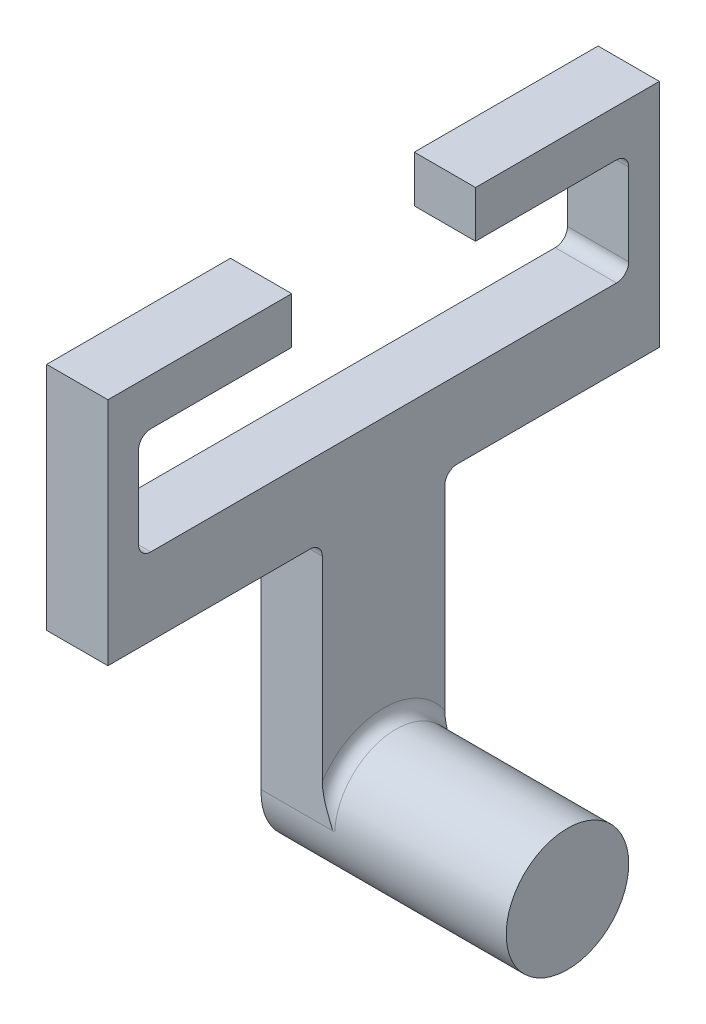
ISO-10303-21;
HEADER;
FILE_DESCRIPTION(('STEP AP214'),'2;1');
FILE_NAME('part.step','',(''),(''),'','','');
FILE_SCHEMA(('AUTOMOTIVE_DESIGN { 1 0 10303 214 1 1 1 1 }'));
ENDSEC;
DATA;
#1=APPLICATION_CONTEXT('core data for automotive mechanical design processes');
#2=APPLICATION_PROTOCOL_DEFINITION('international standard','automotive_design',2000,#1);
#3=PRODUCT_CONTEXT('',#1,'mechanical');
#4=PRODUCT('Part','Part','',(#3));
#5=PRODUCT_RELATED_PRODUCT_CATEGORY('part','',(#4));
#6=PRODUCT_DEFINITION_FORMATION('','',#4);
#7=PRODUCT_DEFINITION_CONTEXT('part definition',#1,'design');
#8=PRODUCT_DEFINITION('design','',#6,#7);
#9=PRODUCT_DEFINITION_SHAPE('','',#8);
#10=(LENGTH_UNIT() NAMED_UNIT(*) SI_UNIT(.MILLI.,.METRE.));
#11=(NAMED_UNIT(*) PLANE_ANGLE_UNIT() SI_UNIT($,.RADIAN.));
#12=(NAMED_UNIT(*) SI_UNIT($,.STERADIAN.) SOLID_ANGLE_UNIT());
#13=UNCERTAINTY_MEASURE_WITH_UNIT(LENGTH_MEASURE(1.E-05),#10,'distance_accuracy_value','');
#14=(GEOMETRIC_REPRESENTATION_CONTEXT(3) GLOBAL_UNCERTAINTY_ASSIGNED_CONTEXT((#13)) GLOBAL_UNIT_ASSIGNED_CONTEXT((#10,
#11,#12)) REPRESENTATION_CONTEXT('',''));
#15=CARTESIAN_POINT('',(0.,0.,0.));
#16=DIRECTION('',(0.,0.,1.));
#17=DIRECTION('',(1.,0.,0.));
#18=AXIS2_PLACEMENT_3D('',#15,#16,#17);
#19=CARTESIAN_POINT('',(12.7,0.60873287463422,-12.6854028035116));
#20=DIRECTION('',(0.,0.,-1.));
#21=DIRECTION('',(-1.,0.,0.));
#22=AXIS2_PLACEMENT_3D('',#19,#20,#21);
#23=PLANE('',#22);
#24=DIRECTION('',(0.,-1.,0.));
#25=VECTOR('',#24,1.);
#26=CARTESIAN_POINT('',(0.,0.60873287463422,-12.6854028035116));
#27=LINE('',#26,#25);
#28=CARTESIAN_POINT('',(0.,48.8512941545788,-12.6854028035116));
#29=VERTEX_POINT('',#28);
#30=CARTESIAN_POINT('',(0.,0.60873287463422,-12.6854028035116));
#31=VERTEX_POINT('',#30);
#32=EDGE_CURVE('E310',#29,#31,#27,.T.);
#33=ORIENTED_EDGE('',*,*,#32,.F.);
#34=DIRECTION('',(1.,0.,0.));
#35=VECTOR('',#34,1.);
#36=CARTESIAN_POINT('',(12.7,48.8512941545788,-12.6854028035116));
#37=LINE('',#36,#35);
#38=CARTESIAN_POINT('',(12.7,48.8512941545788,-12.6854028035116));
#39=VERTEX_POINT('',#38);
#40=EDGE_CURVE('E345',#29,#39,#37,.T.);
#41=ORIENTED_EDGE('',*,*,#40,.T.);
#42=DIRECTION('',(0.,-1.,0.));
#43=VECTOR('',#42,1.);
#44=CARTESIAN_POINT('',(12.7,0.60873287463422,-12.6854028035116));
#45=LINE('',#44,#43);
#46=CARTESIAN_POINT('',(12.7,8.44619178758454,-12.6854028035116));
#47=VERTEX_POINT('',#46);
#48=EDGE_CURVE('E313',#39,#47,#45,.T.);
#49=ORIENTED_EDGE('',*,*,#48,.T.);
#50=CARTESIAN_POINT('',(12.7,8.44619178758454,-12.6854028035116));
#51=CARTESIAN_POINT('',(12.7000199538334,8.29108034894553,-12.6854028035116));
#52=CARTESIAN_POINT('',(12.7043629306303,8.13601724831458,-12.6854028035116));
#53=CARTESIAN_POINT('',(12.7208410975088,7.82638745973549,-12.6854028035116));
#54=CARTESIAN_POINT('',(12.7329718359365,7.67182053885642,-12.6854028035116));
#55=CARTESIAN_POINT('',(12.7641344973862,7.36379204516032,-12.6854028035116));
#56=CARTESIAN_POINT('',(12.783149021093,7.21032867166333,-12.6854028035116));
#57=CARTESIAN_POINT('',(12.827370309528,6.90428378887194,-12.6854028035116));
#58=CARTESIAN_POINT('',(12.8525780510233,6.75170242257287,-12.6854028035116));
#59=CARTESIAN_POINT('',(12.9361065344603,6.29765825085691,-12.6854028035116));
#60=CARTESIAN_POINT('',(13.0025760106628,5.99768071526703,-12.6854028035116));
#61=CARTESIAN_POINT('',(13.1530521629393,5.4020947167015,-12.6854028035116));
#62=CARTESIAN_POINT('',(13.2370685109218,5.10648875998791,-12.6854028035116));
#63=CARTESIAN_POINT('',(13.4065882409218,4.56012538132683,-12.6854028035116));
#64=CARTESIAN_POINT('',(13.4902900992569,4.30880288484307,-12.6854028035116));
#65=CARTESIAN_POINT('',(13.6663463153401,3.80910815345246,-12.6854028035116));
#66=CARTESIAN_POINT('',(13.7587043355169,3.56073721788861,-12.6854028035116));
#67=CARTESIAN_POINT('',(13.9841718850627,2.98011271995535,-12.6854028035116));
#68=CARTESIAN_POINT('',(14.1202113648025,2.64899797616776,-12.6854028035116));
#69=CARTESIAN_POINT('',(14.3551273511572,2.10415574355069,-12.6854028035116));
#70=CARTESIAN_POINT('',(14.4507886346712,1.88903616348578,-12.6854028035116));
#71=CARTESIAN_POINT('',(14.6141782447484,1.53662732210931,-12.6854028035116));
#72=CARTESIAN_POINT('',(14.6799668565523,1.39844538977251,-12.6854028035116));
#73=CARTESIAN_POINT('',(14.7931167203293,1.17290997907176,-12.6854028035116));
#74=CARTESIAN_POINT('',(14.8388326494562,1.08475334883655,-12.6854028035116));
#75=CARTESIAN_POINT('',(14.9188994339259,0.941580735642722,-12.6854028035116));
#76=CARTESIAN_POINT('',(14.9516762265903,0.885697896916426,-12.6854028035116));
#77=CARTESIAN_POINT('',(15.0105568919323,0.795522676826605,-12.6854028035116));
#78=CARTESIAN_POINT('',(15.0351676302852,0.760321213460615,-12.6854028035116));
#79=CARTESIAN_POINT('',(15.0759831932472,0.710346334781367,-12.6854028035116));
#80=CARTESIAN_POINT('',(15.090331012591,0.694075154560967,-12.6854028035116));
#81=CARTESIAN_POINT('',(15.1210882623445,0.663571339352901,-12.6854028035116));
#82=CARTESIAN_POINT('',(15.1374862345175,0.649328248766124,-12.6854028035116));
#83=CARTESIAN_POINT('',(15.1627471893593,0.632590206960592,-12.6854028035116));
#84=CARTESIAN_POINT('',(15.1702880497681,0.62814758762387,-12.6854028035116));
#85=CARTESIAN_POINT('',(15.1859064876263,0.6204017604568,-12.6854028035116));
#86=CARTESIAN_POINT('',(15.1939810619624,0.617092733103913,-12.6854028035116));
#87=CARTESIAN_POINT('',(15.2083621731441,0.612684306654888,-12.6854028035116));
#88=CARTESIAN_POINT('',(15.2145580073585,0.611229628175883,-12.6854028035116));
#89=CARTESIAN_POINT('',(15.227162237969,0.609241410298296,-12.6854028035116));
#90=CARTESIAN_POINT('',(15.2335722121879,0.608718047644989,-12.6854028035116));
#91=CARTESIAN_POINT('',(15.24,0.608732874634247,-12.6854028035116));
#92=B_SPLINE_CURVE_WITH_KNOTS('',3,(#50,#51,#52,#53,#54,#55,#56,#57,#58,#59,#60,#61,#62,#63,#64,
#65,#66,#67,#68,#69,#70,#71,#72,#73,#74,#75,#76,#77,#78,#79,#80,#81,#82,#83,#84,#85,#86,#87,#88,
#89,#90,#91),.UNSPECIFIED.,.F.,.F.,(4,2,2,2,2,2,2,2,2,2,2,2,2,2,2,2,2,2,2,2,4),(0.,
0.465204438937266,0.930143193380325,1.3939148903106,1.85775977829041,2.77878287334151,
3.70031498637004,4.49481370709974,5.2896501115556,6.36331651432781,7.06953483439223,
7.52861759673658,7.82642837376192,8.0207069914985,8.14926890803821,8.21429199137582,
8.27896667442439,8.30515911704494,8.33121500647696,8.35024147580575,8.36947460475692),.UNSPECIFIED.);
#93=CARTESIAN_POINT('',(15.24,0.60873287463422,-12.6854028035116));
#94=VERTEX_POINT('',#93);
#95=EDGE_CURVE('E413',#47,#94,#92,.T.);
#96=ORIENTED_EDGE('',*,*,#95,.T.);
#97=DIRECTION('',(-1.,0.,0.));
#98=VECTOR('',#97,1.);
#99=CARTESIAN_POINT('',(12.7,0.60873287463422,-12.6854028035116));
#100=LINE('',#99,#98);
#101=EDGE_CURVE('E323',#94,#31,#100,.T.);
#102=ORIENTED_EDGE('',*,*,#101,.T.);
#103=EDGE_LOOP('',(#33,#41,#49,#96,#102));
#104=FACE_BOUND('',#103,.T.);
#105=ADVANCED_FACE('F47',(#104),#23,.T.);
#106=CARTESIAN_POINT('',(12.7,0.60873287463422,12.7145971964884));
#107=DIRECTION('',(0.,0.,1.));
#108=DIRECTION('',(1.,0.,0.));
#109=AXIS2_PLACEMENT_3D('',#106,#107,#108);
#110=PLANE('',#109);
#111=DIRECTION('',(0.,1.,0.));
#112=VECTOR('',#111,1.);
#113=CARTESIAN_POINT('',(12.7,0.60873287463422,12.7145971964884));
#114=LINE('',#113,#112);
#115=CARTESIAN_POINT('',(12.7,8.40217936794073,12.7145971964884));
#116=VERTEX_POINT('',#115);
#117=CARTESIAN_POINT('',(12.7,48.8512941545788,12.7145971964884));
#118=VERTEX_POINT('',#117);
#119=EDGE_CURVE('E320',#116,#118,#114,.T.);
#120=ORIENTED_EDGE('',*,*,#119,.T.);
#121=DIRECTION('',(-1.,0.,0.));
#122=VECTOR('',#121,1.);
#123=CARTESIAN_POINT('',(12.7,48.8512941545788,12.7145971964884));
#124=LINE('',#123,#122);
#125=CARTESIAN_POINT('',(0.,48.8512941545788,12.7145971964884));
#126=VERTEX_POINT('',#125);
#127=EDGE_CURVE('E340',#118,#126,#124,.T.);
#128=ORIENTED_EDGE('',*,*,#127,.T.);
#129=DIRECTION('',(0.,1.,0.));
#130=VECTOR('',#129,1.);
#131=CARTESIAN_POINT('',(0.,0.60873287463422,12.7145971964884));
#132=LINE('',#131,#130);
#133=CARTESIAN_POINT('',(0.,0.60873287463422,12.7145971964884));
#134=VERTEX_POINT('',#133);
#135=EDGE_CURVE('E319',#134,#126,#132,.T.);
#136=ORIENTED_EDGE('',*,*,#135,.F.);
#137=DIRECTION('',(-1.,0.,0.));
#138=VECTOR('',#137,1.);
#139=CARTESIAN_POINT('',(12.7,0.60873287463422,12.7145971964884));
#140=LINE('',#139,#138);
#141=CARTESIAN_POINT('',(14.8562200036249,0.60873287463422,12.7145971964884));
#142=VERTEX_POINT('',#141);
#143=EDGE_CURVE('E65',#142,#134,#140,.T.);
#144=ORIENTED_EDGE('',*,*,#143,.F.);
#145=CARTESIAN_POINT('',(14.8562200036249,0.60873287463422,12.7145971964884));
#146=CARTESIAN_POINT('',(14.8402694847375,0.659588422944848,12.7145971964884));
#147=CARTESIAN_POINT('',(14.8235087742083,0.710176230850901,12.7145971964884));
#148=CARTESIAN_POINT('',(14.7888182074626,0.810938242437549,12.7145971964884));
#149=CARTESIAN_POINT('',(14.7708886218373,0.861112538836686,12.7145971964884));
#150=CARTESIAN_POINT('',(14.7160247264327,1.0111962412902,12.7145971964884));
#151=CARTESIAN_POINT('',(14.678002958574,1.11070345786644,12.7145971964884));
#152=CARTESIAN_POINT('',(14.600720334161,1.30920367864751,12.7145971964884));
#153=CARTESIAN_POINT('',(14.5614597366873,1.40819678539233,12.7145971964884));
#154=CARTESIAN_POINT('',(14.4824555540848,1.60600135321982,12.7145971964884));
#155=CARTESIAN_POINT('',(14.4427119214337,1.70481279531061,12.7145971964884));
#156=CARTESIAN_POINT('',(14.3631168168194,1.90261959578859,12.7145971964884));
#157=CARTESIAN_POINT('',(14.323265287225,2.00161493061581,12.7145971964884));
#158=CARTESIAN_POINT('',(14.2438242998515,2.19970723356204,12.7145971964884));
#159=CARTESIAN_POINT('',(14.2042348341503,2.2988041985033,12.7145971964884));
#160=CARTESIAN_POINT('',(14.0861881045338,2.59638439660759,12.7145971964884));
#161=CARTESIAN_POINT('',(14.0084527984396,2.79515622140498,12.7145971964884));
#162=CARTESIAN_POINT('',(13.8571525497217,3.19147992719812,12.7145971964884));
#163=CARTESIAN_POINT('',(13.7835479833466,3.38901659640052,12.7145971964884));
#164=CARTESIAN_POINT('',(13.6405361506529,3.78562343086022,12.7145971964884));
#165=CARTESIAN_POINT('',(13.5711291157381,3.98469367998075,12.7145971964884));
#166=CARTESIAN_POINT('',(13.4376028242129,4.38443951433526,12.7145971964884));
#167=CARTESIAN_POINT('',(13.3734795237288,4.58511374047197,12.7145971964884));
#168=CARTESIAN_POINT('',(13.2515468994044,4.98835789996981,12.7145971964884));
#169=CARTESIAN_POINT('',(13.1937369554773,5.19092764503079,12.7145971964884));
#170=CARTESIAN_POINT('',(13.0747227568141,5.63899216353251,12.7145971964884));
#171=CARTESIAN_POINT('',(13.0151710157626,5.88493241780108,12.7145971964884));
#172=CARTESIAN_POINT('',(12.9091527429067,6.37957322216482,12.7145971964884));
#173=CARTESIAN_POINT('',(12.8626824079347,6.62827294809519,12.7145971964884));
#174=CARTESIAN_POINT('',(12.7851756403372,7.1301195241584,12.7145971964884));
#175=CARTESIAN_POINT('',(12.7542607420377,7.38328586936984,12.7145971964884));
#176=CARTESIAN_POINT('',(12.7223246047862,7.76442486092579,12.7145971964884));
#177=CARTESIAN_POINT('',(12.7140844616977,7.8918052269845,12.7145971964884));
#178=CARTESIAN_POINT('',(12.702925425082,8.14683970565905,12.7145971964884));
#179=CARTESIAN_POINT('',(12.7000083768433,8.27449389785143,12.7145971964884));
#180=CARTESIAN_POINT('',(12.7,8.40217936794073,12.7145971964884));
#181=B_SPLINE_CURVE_WITH_KNOTS('',3,(#145,#146,#147,#148,#149,#150,#151,#152,#153,#154,#155,
#156,#157,#158,#159,#160,#161,#162,#163,#164,#165,#166,#167,#168,#169,#170,#171,#172,#173,#174,
#175,#176,#177,#178,#179,#180),.UNSPECIFIED.,.F.,.F.,(4,2,2,2,2,2,2,2,2,2,2,2,2,2,2,2,2,4),(0.,
0.159869498076522,0.319702117349971,0.63925043722674,0.958732366143434,1.27824598527545,
1.5983927553695,1.91852980312207,2.55880620434556,3.19118197679594,3.82359257948346,
4.45551458590317,5.08737447013136,5.84621241770441,6.60482951932476,7.36928506259811,
7.75212583984181,8.13509930637001),.UNSPECIFIED.);
#182=EDGE_CURVE('E390',#142,#116,#181,.T.);
#183=ORIENTED_EDGE('',*,*,#182,.T.);
#184=EDGE_LOOP('',(#120,#128,#136,#144,#183));
#185=FACE_BOUND('',#184,.T.);
#186=ADVANCED_FACE('F408',(#185),#110,.T.);
#187=CARTESIAN_POINT('',(50.8,0.,0.));
#188=DIRECTION('',(-1.,0.,0.));
#189=DIRECTION('',(0.,0.,1.));
#190=AXIS2_PLACEMENT_3D('',#187,#188,#189);
#191=CYLINDRICAL_SURFACE('',#190,12.7);
#192=CARTESIAN_POINT('',(50.8,0.,0.));
#193=DIRECTION('',(1.,0.,0.));
#194=DIRECTION('',(0.,0.,-1.));
#195=AXIS2_PLACEMENT_3D('',#192,#193,#194);
#196=CIRCLE('',#195,12.7);
#197=CARTESIAN_POINT('',(50.8,0.,-12.7));
#198=VERTEX_POINT('',#197);
#199=EDGE_CURVE('E334',#198,#198,#196,.T.);
#200=ORIENTED_EDGE('',*,*,#199,.F.);
#201=EDGE_LOOP('',(#200));
#202=FACE_BOUND('',#201,.T.);
#203=CARTESIAN_POINT('',(15.24,0.,0.));
#204=DIRECTION('',(1.,0.,0.));
#205=DIRECTION('',(0.,0.,-1.));
#206=AXIS2_PLACEMENT_3D('',#203,#204,#205);
#207=CIRCLE('',#206,12.7);
#208=CARTESIAN_POINT('',(15.24,0.60873287463422,12.6854028035116));
#209=VERTEX_POINT('',#208);
#210=EDGE_CURVE('E346',#94,#209,#207,.T.);
#211=ORIENTED_EDGE('',*,*,#210,.T.);
#212=DIRECTION('',(-1.,0.,0.));
#213=VECTOR('',#212,1.);
#214=CARTESIAN_POINT('',(50.8,0.60873287463422,12.6854028035116));
#215=LINE('',#214,#213);
#216=CARTESIAN_POINT('',(0.,0.60873287463422,12.6854028035116));
#217=VERTEX_POINT('',#216);
#218=EDGE_CURVE('E329',#209,#217,#215,.T.);
#219=ORIENTED_EDGE('',*,*,#218,.T.);
#220=CARTESIAN_POINT('',(0.,0.,0.));
#221=DIRECTION('',(1.,0.,0.));
#222=DIRECTION('',(0.,0.,-1.));
#223=AXIS2_PLACEMENT_3D('',#220,#221,#222);
#224=CIRCLE('',#223,12.7);
#225=EDGE_CURVE('E333',#217,#31,#224,.T.);
#226=ORIENTED_EDGE('',*,*,#225,.T.);
#227=ORIENTED_EDGE('',*,*,#101,.F.);
#228=EDGE_LOOP('',(#211,#219,#226,#227));
#229=FACE_BOUND('',#228,.T.);
#230=ADVANCED_FACE('F530',(#202,#229),#191,.T.);
#231=CARTESIAN_POINT('',(50.8,0.,0.));
#232=DIRECTION('',(1.,0.,0.));
#233=DIRECTION('',(0.,0.,-1.));
#234=AXIS2_PLACEMENT_3D('',#231,#232,#233);
#235=PLANE('',#234);
#236=ORIENTED_EDGE('',*,*,#199,.T.);
#237=EDGE_LOOP('',(#236));
#238=FACE_BOUND('',#237,.T.);
#239=ADVANCED_FACE('F414',(#238),#235,.T.);
#240=CARTESIAN_POINT('',(0.,0.,0.));
#241=DIRECTION('',(1.,0.,0.));
#242=DIRECTION('',(0.,0.,-1.));
#243=AXIS2_PLACEMENT_3D('',#240,#241,#242);
#244=PLANE('',#243);
#245=DIRECTION('',(0.,0.,-1.));
#246=VECTOR('',#245,1.);
#247=CARTESIAN_POINT('',(0.,51.3912941545788,-50.8));
#248=LINE('',#247,#246);
#249=CARTESIAN_POINT('',(0.,51.3912941545788,-15.2254028035116));
#250=VERTEX_POINT('',#249);
#251=CARTESIAN_POINT('',(0.,51.3912941545788,-57.15));
#252=VERTEX_POINT('',#251);
#253=EDGE_CURVE('E288',#250,#252,#248,.T.);
#254=ORIENTED_EDGE('',*,*,#253,.F.);
#255=CARTESIAN_POINT('',(0.,48.8512941545788,-15.2254028035116));
#256=DIRECTION('',(1.,0.,0.));
#257=DIRECTION('',(0.,0.,-1.));
#258=AXIS2_PLACEMENT_3D('',#255,#256,#257);
#259=CIRCLE('',#258,2.54);
#260=EDGE_CURVE('E378',#250,#29,#259,.T.);
#261=ORIENTED_EDGE('',*,*,#260,.T.);
#262=ORIENTED_EDGE('',*,*,#32,.T.);
#263=ORIENTED_EDGE('',*,*,#225,.F.);
#264=DIRECTION('',(0.,0.,1.));
#265=VECTOR('',#264,1.);
#266=CARTESIAN_POINT('',(0.,0.60873287463422,-12.6854028035116));
#267=LINE('',#266,#265);
#268=EDGE_CURVE('E322',#217,#134,#267,.T.);
#269=ORIENTED_EDGE('',*,*,#268,.T.);
#270=ORIENTED_EDGE('',*,*,#135,.T.);
#271=CARTESIAN_POINT('',(0.,48.8512941545788,15.2545971964884));
#272=DIRECTION('',(1.,0.,0.));
#273=DIRECTION('',(0.,0.,-1.));
#274=AXIS2_PLACEMENT_3D('',#271,#272,#273);
#275=CIRCLE('',#274,2.54);
#276=CARTESIAN_POINT('',(0.,51.3912941545788,15.2545971964884));
#277=VERTEX_POINT('',#276);
#278=EDGE_CURVE('E373',#126,#277,#275,.T.);
#279=ORIENTED_EDGE('',*,*,#278,.T.);
#280=CARTESIAN_POINT('',(0.,51.3912941545788,57.15));
#281=VERTEX_POINT('',#280);
#282=EDGE_CURVE('E308',#281,#277,#248,.T.);
#283=ORIENTED_EDGE('',*,*,#282,.F.);
#284=DIRECTION('',(0.,-1.,0.));
#285=VECTOR('',#284,1.);
#286=CARTESIAN_POINT('',(0.,51.3912941545788,57.15));
#287=LINE('',#286,#285);
#288=CARTESIAN_POINT('',(0.,99.1432941545788,57.15));
#289=VERTEX_POINT('',#288);
#290=EDGE_CURVE('E279',#289,#281,#287,.T.);
#291=ORIENTED_EDGE('',*,*,#290,.F.);
#292=DIRECTION('',(0.,0.,1.));
#293=VECTOR('',#292,1.);
#294=CARTESIAN_POINT('',(0.,99.1432941545788,57.15));
#295=LINE('',#294,#293);
#296=CARTESIAN_POINT('',(0.,99.1432941545788,19.05));
#297=VERTEX_POINT('',#296);
#298=EDGE_CURVE('E224',#297,#289,#295,.T.);
#299=ORIENTED_EDGE('',*,*,#298,.F.);
#300=DIRECTION('',(0.,1.,0.));
#301=VECTOR('',#300,1.);
#302=CARTESIAN_POINT('',(0.,89.4912941545788,19.05));
#303=LINE('',#302,#301);
#304=CARTESIAN_POINT('',(0.,89.4912941545788,19.05));
#305=VERTEX_POINT('',#304);
#306=EDGE_CURVE('E242',#305,#297,#303,.T.);
#307=ORIENTED_EDGE('',*,*,#306,.F.);
#308=DIRECTION('',(0.,0.,-1.));
#309=VECTOR('',#308,1.);
#310=CARTESIAN_POINT('',(0.,89.4912941545788,57.15));
#311=LINE('',#310,#309);
#312=CARTESIAN_POINT('',(0.,89.4912941545788,48.26));
#313=VERTEX_POINT('',#312);
#314=EDGE_CURVE('E230',#313,#305,#311,.T.);
#315=ORIENTED_EDGE('',*,*,#314,.F.);
#316=CARTESIAN_POINT('',(0.,86.9512941545788,48.26));
#317=DIRECTION('',(1.,0.,0.));
#318=DIRECTION('',(0.,0.,-1.));
#319=AXIS2_PLACEMENT_3D('',#316,#317,#318);
#320=CIRCLE('',#319,2.54);
#321=CARTESIAN_POINT('',(0.,86.9512941545788,50.8));
#322=VERTEX_POINT('',#321);
#323=EDGE_CURVE('E75',#313,#322,#320,.T.);
#324=ORIENTED_EDGE('',*,*,#323,.T.);
#325=DIRECTION('',(0.,1.,0.));
#326=VECTOR('',#325,1.);
#327=CARTESIAN_POINT('',(0.,51.3912941545788,50.8));
#328=LINE('',#327,#326);
#329=CARTESIAN_POINT('',(0.,69.9332941545788,50.8));
#330=VERTEX_POINT('',#329);
#331=EDGE_CURVE('E282',#330,#322,#328,.T.);
#332=ORIENTED_EDGE('',*,*,#331,.F.);
#333=CARTESIAN_POINT('',(0.,69.9332941545788,48.26));
#334=DIRECTION('',(1.,0.,0.));
#335=DIRECTION('',(0.,0.,-1.));
#336=AXIS2_PLACEMENT_3D('',#333,#334,#335);
#337=CIRCLE('',#336,2.54);
#338=CARTESIAN_POINT('',(0.,67.3932941545788,48.26));
#339=VERTEX_POINT('',#338);
#340=EDGE_CURVE('E60',#330,#339,#337,.T.);
#341=ORIENTED_EDGE('',*,*,#340,.T.);
#342=DIRECTION('',(0.,0.,1.));
#343=VECTOR('',#342,1.);
#344=CARTESIAN_POINT('',(0.,67.3932941545788,-50.8));
#345=LINE('',#344,#343);
#346=CARTESIAN_POINT('',(0.,67.3932941545788,-48.26));
#347=VERTEX_POINT('',#346);
#348=EDGE_CURVE('E311',#347,#339,#345,.T.);
#349=ORIENTED_EDGE('',*,*,#348,.F.);
#350=CARTESIAN_POINT('',(0.,69.9332941545788,-48.26));
#351=DIRECTION('',(1.,0.,0.));
#352=DIRECTION('',(0.,0.,-1.));
#353=AXIS2_PLACEMENT_3D('',#350,#351,#352);
#354=CIRCLE('',#353,2.54);
#355=CARTESIAN_POINT('',(0.,69.9332941545788,-50.8));
#356=VERTEX_POINT('',#355);
#357=EDGE_CURVE('E428',#347,#356,#354,.T.);
#358=ORIENTED_EDGE('',*,*,#357,.T.);
#359=DIRECTION('',(0.,-1.,0.));
#360=VECTOR('',#359,1.);
#361=CARTESIAN_POINT('',(0.,51.3912941545788,-50.8));
#362=LINE('',#361,#360);
#363=CARTESIAN_POINT('',(0.,86.9512941545788,-50.8));
#364=VERTEX_POINT('',#363);
#365=EDGE_CURVE('E284',#364,#356,#362,.T.);
#366=ORIENTED_EDGE('',*,*,#365,.F.);
#367=CARTESIAN_POINT('',(0.,86.9512941545788,-48.26));
#368=DIRECTION('',(1.,0.,0.));
#369=DIRECTION('',(0.,0.,-1.));
#370=AXIS2_PLACEMENT_3D('',#367,#368,#369);
#371=CIRCLE('',#370,2.54);
#372=CARTESIAN_POINT('',(0.,89.4912941545788,-48.26));
#373=VERTEX_POINT('',#372);
#374=EDGE_CURVE('E422',#364,#373,#371,.T.);
#375=ORIENTED_EDGE('',*,*,#374,.T.);
#376=DIRECTION('',(0.,0.,-1.));
#377=VECTOR('',#376,1.);
#378=CARTESIAN_POINT('',(0.,89.4912941545788,-57.15));
#379=LINE('',#378,#377);
#380=CARTESIAN_POINT('',(0.,89.4912941545788,-19.05));
#381=VERTEX_POINT('',#380);
#382=EDGE_CURVE('E265',#381,#373,#379,.T.);
#383=ORIENTED_EDGE('',*,*,#382,.F.);
#384=DIRECTION('',(0.,-1.,0.));
#385=VECTOR('',#384,1.);
#386=CARTESIAN_POINT('',(0.,89.4912941545788,-19.05));
#387=LINE('',#386,#385);
#388=CARTESIAN_POINT('',(0.,99.1432941545788,-19.05));
#389=VERTEX_POINT('',#388);
#390=EDGE_CURVE('E263',#389,#381,#387,.T.);
#391=ORIENTED_EDGE('',*,*,#390,.F.);
#392=DIRECTION('',(0.,0.,1.));
#393=VECTOR('',#392,1.);
#394=CARTESIAN_POINT('',(0.,99.1432941545788,-57.15));
#395=LINE('',#394,#393);
#396=CARTESIAN_POINT('',(0.,99.1432941545788,-57.15));
#397=VERTEX_POINT('',#396);
#398=EDGE_CURVE('E244',#397,#389,#395,.T.);
#399=ORIENTED_EDGE('',*,*,#398,.F.);
#400=DIRECTION('',(0.,1.,0.));
#401=VECTOR('',#400,1.);
#402=CARTESIAN_POINT('',(0.,51.3912941545788,-57.15));
#403=LINE('',#402,#401);
#404=EDGE_CURVE('E292',#252,#397,#403,.T.);
#405=ORIENTED_EDGE('',*,*,#404,.F.);
#406=EDGE_LOOP('',(#254,#261,#262,#263,#269,#270,#279,#283,#291,#299,#307,#315,#324,#332,#341,
#349,#358,#366,#375,#383,#391,#399,#405));
#407=FACE_BOUND('',#406,.T.);
#408=ADVANCED_FACE('F404',(#407),#244,.F.);
#409=CARTESIAN_POINT('',(12.7,0.60873287463422,-12.6854028035116));
#410=DIRECTION('',(0.,-1.,0.));
#411=DIRECTION('',(0.,0.,-1.));
#412=AXIS2_PLACEMENT_3D('',#409,#410,#411);
#413=PLANE('',#412);
#414=ORIENTED_EDGE('',*,*,#218,.F.);
#415=CARTESIAN_POINT('',(15.24,0.60873287463422,12.6854028035116));
#416=CARTESIAN_POINT('',(15.1756670661884,0.60873287463422,12.6854098800125));
#417=CARTESIAN_POINT('',(15.1115189329188,0.60873287463422,12.6878462843443));
#418=CARTESIAN_POINT('',(14.9835922674604,0.60873287463422,12.6975777486697));
#419=CARTESIAN_POINT('',(14.9198137352716,0.60873287463422,12.7048728086636));
#420=CARTESIAN_POINT('',(14.8562200036249,0.60873287463422,12.7145971964886));
#421=B_SPLINE_CURVE_WITH_KNOTS('',3,(#415,#416,#417,#418,#419,#420),.UNSPECIFIED.,.F.,.F.,(4,2,
4),(0.,0.192583155058695,0.385166310127452),.UNSPECIFIED.);
#422=EDGE_CURVE('E382',#209,#142,#421,.T.);
#423=ORIENTED_EDGE('',*,*,#422,.T.);
#424=ORIENTED_EDGE('',*,*,#143,.T.);
#425=ORIENTED_EDGE('',*,*,#268,.F.);
#426=EDGE_LOOP('',(#414,#423,#424,#425));
#427=FACE_BOUND('',#426,.T.);
#428=ADVANCED_FACE('F396',(#427),#413,.T.);
#429=CARTESIAN_POINT('',(12.7,0.,0.));
#430=DIRECTION('',(1.,0.,0.));
#431=DIRECTION('',(0.,0.,-1.));
#432=AXIS2_PLACEMENT_3D('',#429,#430,#431);
#433=PLANE('',#432);
#434=ORIENTED_EDGE('',*,*,#119,.F.);
#435=CARTESIAN_POINT('',(12.7,0.,0.));
#436=DIRECTION('',(1.,0.,0.));
#437=DIRECTION('',(0.,0.,-1.));
#438=AXIS2_PLACEMENT_3D('',#435,#436,#437);
#439=CIRCLE('',#438,15.24);
#440=EDGE_CURVE('E355',#116,#47,#439,.F.);
#441=ORIENTED_EDGE('',*,*,#440,.T.);
#442=ORIENTED_EDGE('',*,*,#48,.F.);
#443=CARTESIAN_POINT('',(12.7,48.8512941545788,-15.2254028035116));
#444=DIRECTION('',(1.,0.,0.));
#445=DIRECTION('',(0.,0.,-1.));
#446=AXIS2_PLACEMENT_3D('',#443,#444,#445);
#447=CIRCLE('',#446,2.54);
#448=CARTESIAN_POINT('',(12.7,51.3912941545788,-15.2254028035116));
#449=VERTEX_POINT('',#448);
#450=EDGE_CURVE('E380',#39,#449,#447,.F.);
#451=ORIENTED_EDGE('',*,*,#450,.T.);
#452=DIRECTION('',(0.,0.,-1.));
#453=VECTOR('',#452,1.);
#454=CARTESIAN_POINT('',(12.7,51.3912941545788,-50.8));
#455=LINE('',#454,#453);
#456=CARTESIAN_POINT('',(12.7,51.3912941545788,-57.15));
#457=VERTEX_POINT('',#456);
#458=EDGE_CURVE('E302',#449,#457,#455,.T.);
#459=ORIENTED_EDGE('',*,*,#458,.T.);
#460=DIRECTION('',(0.,1.,0.));
#461=VECTOR('',#460,1.);
#462=CARTESIAN_POINT('',(12.7,51.3912941545788,-57.15));
#463=LINE('',#462,#461);
#464=CARTESIAN_POINT('',(12.7,99.1432941545788,-57.15));
#465=VERTEX_POINT('',#464);
#466=EDGE_CURVE('E293',#457,#465,#463,.T.);
#467=ORIENTED_EDGE('',*,*,#466,.T.);
#468=DIRECTION('',(0.,0.,1.));
#469=VECTOR('',#468,1.);
#470=CARTESIAN_POINT('',(12.7,99.1432941545788,-57.15));
#471=LINE('',#470,#469);
#472=CARTESIAN_POINT('',(12.7,99.1432941545788,-19.05));
#473=VERTEX_POINT('',#472);
#474=EDGE_CURVE('E267',#465,#473,#471,.T.);
#475=ORIENTED_EDGE('',*,*,#474,.T.);
#476=DIRECTION('',(0.,-1.,0.));
#477=VECTOR('',#476,1.);
#478=CARTESIAN_POINT('',(12.7,89.4912941545788,-19.05));
#479=LINE('',#478,#477);
#480=CARTESIAN_POINT('',(12.7,89.4912941545788,-19.05));
#481=VERTEX_POINT('',#480);
#482=EDGE_CURVE('E272',#473,#481,#479,.T.);
#483=ORIENTED_EDGE('',*,*,#482,.T.);
#484=DIRECTION('',(0.,0.,-1.));
#485=VECTOR('',#484,1.);
#486=CARTESIAN_POINT('',(12.7,89.4912941545788,-57.15));
#487=LINE('',#486,#485);
#488=CARTESIAN_POINT('',(12.7,89.4912941545788,-48.26));
#489=VERTEX_POINT('',#488);
#490=EDGE_CURVE('E262',#481,#489,#487,.T.);
#491=ORIENTED_EDGE('',*,*,#490,.T.);
#492=CARTESIAN_POINT('',(12.7,86.9512941545788,-48.26));
#493=DIRECTION('',(1.,0.,0.));
#494=DIRECTION('',(0.,0.,-1.));
#495=AXIS2_PLACEMENT_3D('',#492,#493,#494);
#496=CIRCLE('',#495,2.54);
#497=CARTESIAN_POINT('',(12.7,86.9512941545788,-50.8));
#498=VERTEX_POINT('',#497);
#499=EDGE_CURVE('E425',#489,#498,#496,.F.);
#500=ORIENTED_EDGE('',*,*,#499,.T.);
#501=DIRECTION('',(0.,-1.,0.));
#502=VECTOR('',#501,1.);
#503=CARTESIAN_POINT('',(12.7,51.3912941545788,-50.8));
#504=LINE('',#503,#502);
#505=CARTESIAN_POINT('',(12.7,69.9332941545788,-50.8));
#506=VERTEX_POINT('',#505);
#507=EDGE_CURVE('E295',#498,#506,#504,.T.);
#508=ORIENTED_EDGE('',*,*,#507,.T.);
#509=CARTESIAN_POINT('',(12.7,69.9332941545788,-48.26));
#510=DIRECTION('',(1.,0.,0.));
#511=DIRECTION('',(0.,0.,-1.));
#512=AXIS2_PLACEMENT_3D('',#509,#510,#511);
#513=CIRCLE('',#512,2.54);
#514=CARTESIAN_POINT('',(12.7,67.3932941545788,-48.26));
#515=VERTEX_POINT('',#514);
#516=EDGE_CURVE('E426',#506,#515,#513,.F.);
#517=ORIENTED_EDGE('',*,*,#516,.T.);
#518=DIRECTION('',(0.,0.,1.));
#519=VECTOR('',#518,1.);
#520=CARTESIAN_POINT('',(12.7,67.3932941545788,-50.8));
#521=LINE('',#520,#519);
#522=CARTESIAN_POINT('',(12.7,67.3932941545788,48.26));
#523=VERTEX_POINT('',#522);
#524=EDGE_CURVE('E303',#515,#523,#521,.T.);
#525=ORIENTED_EDGE('',*,*,#524,.T.);
#526=CARTESIAN_POINT('',(12.7,69.9332941545788,48.26));
#527=DIRECTION('',(1.,0.,0.));
#528=DIRECTION('',(0.,0.,-1.));
#529=AXIS2_PLACEMENT_3D('',#526,#527,#528);
#530=CIRCLE('',#529,2.54);
#531=CARTESIAN_POINT('',(12.7,69.9332941545788,50.8));
#532=VERTEX_POINT('',#531);
#533=EDGE_CURVE('E11',#523,#532,#530,.F.);
#534=ORIENTED_EDGE('',*,*,#533,.T.);
#535=DIRECTION('',(0.,1.,0.));
#536=VECTOR('',#535,1.);
#537=CARTESIAN_POINT('',(12.7,51.3912941545788,50.8));
#538=LINE('',#537,#536);
#539=CARTESIAN_POINT('',(12.7,86.9512941545788,50.8));
#540=VERTEX_POINT('',#539);
#541=EDGE_CURVE('E274',#532,#540,#538,.T.);
#542=ORIENTED_EDGE('',*,*,#541,.T.);
#543=CARTESIAN_POINT('',(12.7,86.9512941545788,48.26));
#544=DIRECTION('',(1.,0.,0.));
#545=DIRECTION('',(0.,0.,-1.));
#546=AXIS2_PLACEMENT_3D('',#543,#544,#545);
#547=CIRCLE('',#546,2.54);
#548=CARTESIAN_POINT('',(12.7,89.4912941545788,48.26));
#549=VERTEX_POINT('',#548);
#550=EDGE_CURVE('E218',#540,#549,#547,.F.);
#551=ORIENTED_EDGE('',*,*,#550,.T.);
#552=DIRECTION('',(0.,0.,-1.));
#553=VECTOR('',#552,1.);
#554=CARTESIAN_POINT('',(12.7,89.4912941545788,57.15));
#555=LINE('',#554,#553);
#556=CARTESIAN_POINT('',(12.7,89.4912941545788,19.05));
#557=VERTEX_POINT('',#556);
#558=EDGE_CURVE('E208',#549,#557,#555,.T.);
#559=ORIENTED_EDGE('',*,*,#558,.T.);
#560=DIRECTION('',(0.,1.,0.));
#561=VECTOR('',#560,1.);
#562=CARTESIAN_POINT('',(12.7,89.4912941545788,19.05));
#563=LINE('',#562,#561);
#564=CARTESIAN_POINT('',(12.7,99.1432941545788,19.05));
#565=VERTEX_POINT('',#564);
#566=EDGE_CURVE('E217',#557,#565,#563,.T.);
#567=ORIENTED_EDGE('',*,*,#566,.T.);
#568=DIRECTION('',(0.,0.,1.));
#569=VECTOR('',#568,1.);
#570=CARTESIAN_POINT('',(12.7,99.1432941545788,57.15));
#571=LINE('',#570,#569);
#572=CARTESIAN_POINT('',(12.7,99.1432941545788,57.15));
#573=VERTEX_POINT('',#572);
#574=EDGE_CURVE('E238',#565,#573,#571,.T.);
#575=ORIENTED_EDGE('',*,*,#574,.T.);
#576=DIRECTION('',(0.,-1.,0.));
#577=VECTOR('',#576,1.);
#578=CARTESIAN_POINT('',(12.7,51.3912941545788,57.15));
#579=LINE('',#578,#577);
#580=CARTESIAN_POINT('',(12.7,51.3912941545788,57.15));
#581=VERTEX_POINT('',#580);
#582=EDGE_CURVE('E278',#573,#581,#579,.T.);
#583=ORIENTED_EDGE('',*,*,#582,.T.);
#584=CARTESIAN_POINT('',(12.7,51.3912941545788,15.2545971964884));
#585=VERTEX_POINT('',#584);
#586=EDGE_CURVE('E297',#581,#585,#455,.T.);
#587=ORIENTED_EDGE('',*,*,#586,.T.);
#588=CARTESIAN_POINT('',(12.7,48.8512941545788,15.2545971964884));
#589=DIRECTION('',(1.,0.,0.));
#590=DIRECTION('',(0.,0.,-1.));
#591=AXIS2_PLACEMENT_3D('',#588,#589,#590);
#592=CIRCLE('',#591,2.54);
#593=EDGE_CURVE('E374',#585,#118,#592,.F.);
#594=ORIENTED_EDGE('',*,*,#593,.T.);
#595=EDGE_LOOP('',(#434,#441,#442,#451,#459,#467,#475,#483,#491,#500,#508,#517,#525,#534,#542,
#551,#559,#567,#575,#583,#587,#594));
#596=FACE_BOUND('',#595,.T.);
#597=ADVANCED_FACE('F212',(#596),#433,.T.);
#598=CARTESIAN_POINT('',(12.7,51.3912941545788,-50.8));
#599=DIRECTION('',(0.,1.,0.));
#600=DIRECTION('',(0.,0.,1.));
#601=AXIS2_PLACEMENT_3D('',#598,#599,#600);
#602=PLANE('',#601);
#603=ORIENTED_EDGE('',*,*,#458,.F.);
#604=DIRECTION('',(1.,0.,0.));
#605=VECTOR('',#604,1.);
#606=CARTESIAN_POINT('',(12.7,51.3912941545788,-15.2254028035116));
#607=LINE('',#606,#605);
#608=EDGE_CURVE('E350',#449,#250,#607,.F.);
#609=ORIENTED_EDGE('',*,*,#608,.T.);
#610=ORIENTED_EDGE('',*,*,#253,.T.);
#611=DIRECTION('',(-1.,0.,0.));
#612=VECTOR('',#611,1.);
#613=CARTESIAN_POINT('',(12.7,51.3912941545788,-57.15));
#614=LINE('',#613,#612);
#615=EDGE_CURVE('E235',#457,#252,#614,.T.);
#616=ORIENTED_EDGE('',*,*,#615,.F.);
#617=EDGE_LOOP('',(#603,#609,#610,#616));
#618=FACE_BOUND('',#617,.T.);
#619=ADVANCED_FACE('F480',(#618),#602,.F.);
#620=ORIENTED_EDGE('',*,*,#282,.T.);
#621=DIRECTION('',(-1.,0.,0.));
#622=VECTOR('',#621,1.);
#623=CARTESIAN_POINT('',(12.7,51.3912941545788,15.2545971964884));
#624=LINE('',#623,#622);
#625=EDGE_CURVE('E344',#277,#585,#624,.F.);
#626=ORIENTED_EDGE('',*,*,#625,.T.);
#627=ORIENTED_EDGE('',*,*,#586,.F.);
#628=DIRECTION('',(-1.,0.,0.));
#629=VECTOR('',#628,1.);
#630=CARTESIAN_POINT('',(12.7,51.3912941545788,57.15));
#631=LINE('',#630,#629);
#632=EDGE_CURVE('E276',#581,#281,#631,.T.);
#633=ORIENTED_EDGE('',*,*,#632,.T.);
#634=EDGE_LOOP('',(#620,#626,#627,#633));
#635=FACE_BOUND('',#634,.T.);
#636=ADVANCED_FACE('F457',(#635),#602,.F.);
#637=CARTESIAN_POINT('',(12.7,67.3932941545788,-50.8));
#638=DIRECTION('',(0.,-1.,0.));
#639=DIRECTION('',(0.,0.,-1.));
#640=AXIS2_PLACEMENT_3D('',#637,#638,#639);
#641=PLANE('',#640);
#642=ORIENTED_EDGE('',*,*,#524,.F.);
#643=DIRECTION('',(-1.,0.,0.));
#644=VECTOR('',#643,1.);
#645=CARTESIAN_POINT('',(0.,67.3932941545788,-48.26));
#646=LINE('',#645,#644);
#647=EDGE_CURVE('E361',#515,#347,#646,.T.);
#648=ORIENTED_EDGE('',*,*,#647,.T.);
#649=ORIENTED_EDGE('',*,*,#348,.T.);
#650=DIRECTION('',(-1.,0.,0.));
#651=VECTOR('',#650,1.);
#652=CARTESIAN_POINT('',(12.7,67.3932941545788,48.26));
#653=LINE('',#652,#651);
#654=EDGE_CURVE('E363',#339,#523,#653,.F.);
#655=ORIENTED_EDGE('',*,*,#654,.T.);
#656=EDGE_LOOP('',(#642,#648,#649,#655));
#657=FACE_BOUND('',#656,.T.);
#658=ADVANCED_FACE('F438',(#657),#641,.F.);
#659=CARTESIAN_POINT('',(12.7,51.3912941545788,-50.8));
#660=DIRECTION('',(0.,0.,-1.));
#661=DIRECTION('',(-1.,0.,0.));
#662=AXIS2_PLACEMENT_3D('',#659,#660,#661);
#663=PLANE('',#662);
#664=ORIENTED_EDGE('',*,*,#507,.F.);
#665=DIRECTION('',(-1.,0.,0.));
#666=VECTOR('',#665,1.);
#667=CARTESIAN_POINT('',(0.,86.9512941545788,-50.8));
#668=LINE('',#667,#666);
#669=EDGE_CURVE('E358',#498,#364,#668,.T.);
#670=ORIENTED_EDGE('',*,*,#669,.T.);
#671=ORIENTED_EDGE('',*,*,#365,.T.);
#672=DIRECTION('',(-1.,0.,0.));
#673=VECTOR('',#672,1.);
#674=CARTESIAN_POINT('',(12.7,69.9332941545788,-50.8));
#675=LINE('',#674,#673);
#676=EDGE_CURVE('E354',#356,#506,#675,.F.);
#677=ORIENTED_EDGE('',*,*,#676,.T.);
#678=EDGE_LOOP('',(#664,#670,#671,#677));
#679=FACE_BOUND('',#678,.T.);
#680=ADVANCED_FACE('F503',(#679),#663,.F.);
#681=CARTESIAN_POINT('',(12.7,51.3912941545788,-57.15));
#682=DIRECTION('',(0.,0.,1.));
#683=DIRECTION('',(1.,0.,0.));
#684=AXIS2_PLACEMENT_3D('',#681,#682,#683);
#685=PLANE('',#684);
#686=ORIENTED_EDGE('',*,*,#404,.T.);
#687=DIRECTION('',(-1.,0.,0.));
#688=VECTOR('',#687,1.);
#689=CARTESIAN_POINT('',(12.7,99.1432941545788,-57.15));
#690=LINE('',#689,#688);
#691=EDGE_CURVE('E255',#465,#397,#690,.T.);
#692=ORIENTED_EDGE('',*,*,#691,.F.);
#693=ORIENTED_EDGE('',*,*,#466,.F.);
#694=ORIENTED_EDGE('',*,*,#615,.T.);
#695=EDGE_LOOP('',(#686,#692,#693,#694));
#696=FACE_BOUND('',#695,.T.);
#697=ADVANCED_FACE('F485',(#696),#685,.F.);
#698=CARTESIAN_POINT('',(12.7,51.3912941545788,50.8));
#699=DIRECTION('',(0.,0.,1.));
#700=DIRECTION('',(1.,0.,0.));
#701=AXIS2_PLACEMENT_3D('',#698,#699,#700);
#702=PLANE('',#701);
#703=ORIENTED_EDGE('',*,*,#331,.T.);
#704=DIRECTION('',(-1.,0.,0.));
#705=VECTOR('',#704,1.);
#706=CARTESIAN_POINT('',(12.7,86.9512941545788,50.8));
#707=LINE('',#706,#705);
#708=EDGE_CURVE('E371',#322,#540,#707,.F.);
#709=ORIENTED_EDGE('',*,*,#708,.T.);
#710=ORIENTED_EDGE('',*,*,#541,.F.);
#711=DIRECTION('',(-1.,0.,0.));
#712=VECTOR('',#711,1.);
#713=CARTESIAN_POINT('',(0.,69.9332941545788,50.8));
#714=LINE('',#713,#712);
#715=EDGE_CURVE('E368',#532,#330,#714,.T.);
#716=ORIENTED_EDGE('',*,*,#715,.T.);
#717=EDGE_LOOP('',(#703,#709,#710,#716));
#718=FACE_BOUND('',#717,.T.);
#719=ADVANCED_FACE('F442',(#718),#702,.F.);
#720=CARTESIAN_POINT('',(12.7,51.3912941545788,57.15));
#721=DIRECTION('',(0.,0.,-1.));
#722=DIRECTION('',(0.,1.,0.));
#723=AXIS2_PLACEMENT_3D('',#720,#721,#722);
#724=PLANE('',#723);
#725=ORIENTED_EDGE('',*,*,#290,.T.);
#726=ORIENTED_EDGE('',*,*,#632,.F.);
#727=ORIENTED_EDGE('',*,*,#582,.F.);
#728=DIRECTION('',(-1.,0.,0.));
#729=VECTOR('',#728,1.);
#730=CARTESIAN_POINT('',(12.7,99.1432941545788,57.15));
#731=LINE('',#730,#729);
#732=EDGE_CURVE('E239',#573,#289,#731,.T.);
#733=ORIENTED_EDGE('',*,*,#732,.T.);
#734=EDGE_LOOP('',(#725,#726,#727,#733));
#735=FACE_BOUND('',#734,.T.);
#736=ADVANCED_FACE('F455',(#735),#724,.F.);
#737=CARTESIAN_POINT('',(12.7,89.4912941545788,57.15));
#738=DIRECTION('',(0.,1.,0.));
#739=DIRECTION('',(0.,0.,1.));
#740=AXIS2_PLACEMENT_3D('',#737,#738,#739);
#741=PLANE('',#740);
#742=ORIENTED_EDGE('',*,*,#558,.F.);
#743=DIRECTION('',(-1.,0.,0.));
#744=VECTOR('',#743,1.);
#745=CARTESIAN_POINT('',(0.,89.4912941545788,48.26));
#746=LINE('',#745,#744);
#747=EDGE_CURVE('E366',#549,#313,#746,.T.);
#748=ORIENTED_EDGE('',*,*,#747,.T.);
#749=ORIENTED_EDGE('',*,*,#314,.T.);
#750=DIRECTION('',(-1.,0.,0.));
#751=VECTOR('',#750,1.);
#752=CARTESIAN_POINT('',(12.7,89.4912941545788,19.05));
#753=LINE('',#752,#751);
#754=EDGE_CURVE('E227',#557,#305,#753,.T.);
#755=ORIENTED_EDGE('',*,*,#754,.F.);
#756=EDGE_LOOP('',(#742,#748,#749,#755));
#757=FACE_BOUND('',#756,.T.);
#758=ADVANCED_FACE('F226',(#757),#741,.F.);
#759=CARTESIAN_POINT('',(12.7,89.4912941545788,19.05));
#760=DIRECTION('',(0.,0.,1.));
#761=DIRECTION('',(1.,0.,0.));
#762=AXIS2_PLACEMENT_3D('',#759,#760,#761);
#763=PLANE('',#762);
#764=ORIENTED_EDGE('',*,*,#306,.T.);
#765=DIRECTION('',(-1.,0.,0.));
#766=VECTOR('',#765,1.);
#767=CARTESIAN_POINT('',(12.7,99.1432941545788,19.05));
#768=LINE('',#767,#766);
#769=EDGE_CURVE('E231',#565,#297,#768,.T.);
#770=ORIENTED_EDGE('',*,*,#769,.F.);
#771=ORIENTED_EDGE('',*,*,#566,.F.);
#772=ORIENTED_EDGE('',*,*,#754,.T.);
#773=EDGE_LOOP('',(#764,#770,#771,#772));
#774=FACE_BOUND('',#773,.T.);
#775=ADVANCED_FACE('F232',(#774),#763,.F.);
#776=CARTESIAN_POINT('',(12.7,99.1432941545788,57.15));
#777=DIRECTION('',(0.,-1.,0.));
#778=DIRECTION('',(0.,0.,-1.));
#779=AXIS2_PLACEMENT_3D('',#776,#777,#778);
#780=PLANE('',#779);
#781=ORIENTED_EDGE('',*,*,#298,.T.);
#782=ORIENTED_EDGE('',*,*,#732,.F.);
#783=ORIENTED_EDGE('',*,*,#574,.F.);
#784=ORIENTED_EDGE('',*,*,#769,.T.);
#785=EDGE_LOOP('',(#781,#782,#783,#784));
#786=FACE_BOUND('',#785,.T.);
#787=ADVANCED_FACE('F446',(#786),#780,.F.);
#788=CARTESIAN_POINT('',(12.7,99.1432941545788,-57.15));
#789=DIRECTION('',(0.,-1.,0.));
#790=DIRECTION('',(0.,0.,-1.));
#791=AXIS2_PLACEMENT_3D('',#788,#789,#790);
#792=PLANE('',#791);
#793=ORIENTED_EDGE('',*,*,#398,.T.);
#794=DIRECTION('',(-1.,0.,0.));
#795=VECTOR('',#794,1.);
#796=CARTESIAN_POINT('',(12.7,99.1432941545788,-19.05));
#797=LINE('',#796,#795);
#798=EDGE_CURVE('E253',#473,#389,#797,.T.);
#799=ORIENTED_EDGE('',*,*,#798,.F.);
#800=ORIENTED_EDGE('',*,*,#474,.F.);
#801=ORIENTED_EDGE('',*,*,#691,.T.);
#802=EDGE_LOOP('',(#793,#799,#800,#801));
#803=FACE_BOUND('',#802,.T.);
#804=ADVANCED_FACE('F488',(#803),#792,.F.);
#805=CARTESIAN_POINT('',(12.7,89.4912941545788,-19.05));
#806=DIRECTION('',(0.,0.,-1.));
#807=DIRECTION('',(-1.,0.,0.));
#808=AXIS2_PLACEMENT_3D('',#805,#806,#807);
#809=PLANE('',#808);
#810=ORIENTED_EDGE('',*,*,#390,.T.);
#811=DIRECTION('',(-1.,0.,0.));
#812=VECTOR('',#811,1.);
#813=CARTESIAN_POINT('',(12.7,89.4912941545788,-19.05));
#814=LINE('',#813,#812);
#815=EDGE_CURVE('E257',#481,#381,#814,.T.);
#816=ORIENTED_EDGE('',*,*,#815,.F.);
#817=ORIENTED_EDGE('',*,*,#482,.F.);
#818=ORIENTED_EDGE('',*,*,#798,.T.);
#819=EDGE_LOOP('',(#810,#816,#817,#818));
#820=FACE_BOUND('',#819,.T.);
#821=ADVANCED_FACE('F495',(#820),#809,.F.);
#822=CARTESIAN_POINT('',(12.7,89.4912941545788,-57.15));
#823=DIRECTION('',(0.,1.,0.));
#824=DIRECTION('',(0.,0.,1.));
#825=AXIS2_PLACEMENT_3D('',#822,#823,#824);
#826=PLANE('',#825);
#827=ORIENTED_EDGE('',*,*,#382,.T.);
#828=DIRECTION('',(-1.,0.,0.));
#829=VECTOR('',#828,1.);
#830=CARTESIAN_POINT('',(12.7,89.4912941545788,-48.26));
#831=LINE('',#830,#829);
#832=EDGE_CURVE('E360',#373,#489,#831,.F.);
#833=ORIENTED_EDGE('',*,*,#832,.T.);
#834=ORIENTED_EDGE('',*,*,#490,.F.);
#835=ORIENTED_EDGE('',*,*,#815,.T.);
#836=EDGE_LOOP('',(#827,#833,#834,#835));
#837=FACE_BOUND('',#836,.T.);
#838=ADVANCED_FACE('F521',(#837),#826,.F.);
#839=CARTESIAN_POINT('',(12.7,48.8512941545788,15.2545971964884));
#840=DIRECTION('',(-1.,0.,0.));
#841=DIRECTION('',(0.,0.,1.));
#842=AXIS2_PLACEMENT_3D('',#839,#840,#841);
#843=CYLINDRICAL_SURFACE('',#842,2.54);
#844=ORIENTED_EDGE('',*,*,#593,.F.);
#845=ORIENTED_EDGE('',*,*,#625,.F.);
#846=ORIENTED_EDGE('',*,*,#278,.F.);
#847=ORIENTED_EDGE('',*,*,#127,.F.);
#848=EDGE_LOOP('',(#844,#845,#846,#847));
#849=FACE_BOUND('',#848,.T.);
#850=ADVANCED_FACE('F456',(#849),#843,.F.);
#851=CARTESIAN_POINT('',(12.7,48.8512941545788,-15.2254028035116));
#852=DIRECTION('',(1.,0.,0.));
#853=DIRECTION('',(0.,0.,-1.));
#854=AXIS2_PLACEMENT_3D('',#851,#852,#853);
#855=CYLINDRICAL_SURFACE('',#854,2.54);
#856=ORIENTED_EDGE('',*,*,#260,.F.);
#857=ORIENTED_EDGE('',*,*,#608,.F.);
#858=ORIENTED_EDGE('',*,*,#450,.F.);
#859=ORIENTED_EDGE('',*,*,#40,.F.);
#860=EDGE_LOOP('',(#856,#857,#858,#859));
#861=FACE_BOUND('',#860,.T.);
#862=ADVANCED_FACE('F474',(#861),#855,.F.);
#863=CARTESIAN_POINT('',(15.24,0.,0.));
#864=DIRECTION('',(1.,0.,0.));
#865=DIRECTION('',(0.,0.,-1.));
#866=AXIS2_PLACEMENT_3D('',#863,#864,#865);
#867=TOROIDAL_SURFACE('',#866,15.24,2.54);
#868=ORIENTED_EDGE('',*,*,#95,.F.);
#869=ORIENTED_EDGE('',*,*,#440,.F.);
#870=ORIENTED_EDGE('',*,*,#182,.F.);
#871=ORIENTED_EDGE('',*,*,#422,.F.);
#872=ORIENTED_EDGE('',*,*,#210,.F.);
#873=EDGE_LOOP('',(#868,#869,#870,#871,#872));
#874=FACE_BOUND('',#873,.T.);
#875=ADVANCED_FACE('F397',(#874),#867,.F.);
#876=CARTESIAN_POINT('',(12.7,86.9512941545788,-48.26));
#877=DIRECTION('',(1.,0.,0.));
#878=DIRECTION('',(0.,0.,-1.));
#879=AXIS2_PLACEMENT_3D('',#876,#877,#878);
#880=CYLINDRICAL_SURFACE('',#879,2.54);
#881=ORIENTED_EDGE('',*,*,#499,.F.);
#882=ORIENTED_EDGE('',*,*,#832,.F.);
#883=ORIENTED_EDGE('',*,*,#374,.F.);
#884=ORIENTED_EDGE('',*,*,#669,.F.);
#885=EDGE_LOOP('',(#881,#882,#883,#884));
#886=FACE_BOUND('',#885,.T.);
#887=ADVANCED_FACE('F499',(#886),#880,.F.);
#888=CARTESIAN_POINT('',(12.7,69.9332941545788,-48.26));
#889=DIRECTION('',(1.,0.,0.));
#890=DIRECTION('',(0.,0.,-1.));
#891=AXIS2_PLACEMENT_3D('',#888,#889,#890);
#892=CYLINDRICAL_SURFACE('',#891,2.54);
#893=ORIENTED_EDGE('',*,*,#516,.F.);
#894=ORIENTED_EDGE('',*,*,#676,.F.);
#895=ORIENTED_EDGE('',*,*,#357,.F.);
#896=ORIENTED_EDGE('',*,*,#647,.F.);
#897=EDGE_LOOP('',(#893,#894,#895,#896));
#898=FACE_BOUND('',#897,.T.);
#899=ADVANCED_FACE('F507',(#898),#892,.F.);
#900=CARTESIAN_POINT('',(12.7,86.9512941545788,48.26));
#901=DIRECTION('',(1.,0.,0.));
#902=DIRECTION('',(0.,0.,-1.));
#903=AXIS2_PLACEMENT_3D('',#900,#901,#902);
#904=CYLINDRICAL_SURFACE('',#903,2.54);
#905=ORIENTED_EDGE('',*,*,#550,.F.);
#906=ORIENTED_EDGE('',*,*,#708,.F.);
#907=ORIENTED_EDGE('',*,*,#323,.F.);
#908=ORIENTED_EDGE('',*,*,#747,.F.);
#909=EDGE_LOOP('',(#905,#906,#907,#908));
#910=FACE_BOUND('',#909,.T.);
#911=ADVANCED_FACE('F447',(#910),#904,.F.);
#912=CARTESIAN_POINT('',(12.7,69.9332941545788,48.26));
#913=DIRECTION('',(1.,0.,0.));
#914=DIRECTION('',(0.,0.,-1.));
#915=AXIS2_PLACEMENT_3D('',#912,#913,#914);
#916=CYLINDRICAL_SURFACE('',#915,2.54);
#917=ORIENTED_EDGE('',*,*,#533,.F.);
#918=ORIENTED_EDGE('',*,*,#654,.F.);
#919=ORIENTED_EDGE('',*,*,#340,.F.);
#920=ORIENTED_EDGE('',*,*,#715,.F.);
#921=EDGE_LOOP('',(#917,#918,#919,#920));
#922=FACE_BOUND('',#921,.T.);
#923=ADVANCED_FACE('F51',(#922),#916,.F.);
#924=CLOSED_SHELL('',(#105,#186,#230,#239,#408,#428,#597,#619,#636,#658,#680,#697,#719,#736,
#758,#775,#787,#804,#821,#838,#850,#862,#875,#887,#899,#911,#923));
#925=MANIFOLD_SOLID_BREP('B2',#924);
#926=ADVANCED_BREP_SHAPE_REPRESENTATION('',(#18,#925),#14);
#927=SHAPE_DEFINITION_REPRESENTATION(#9,#926);
ENDSEC;
END-ISO-10303-21;
